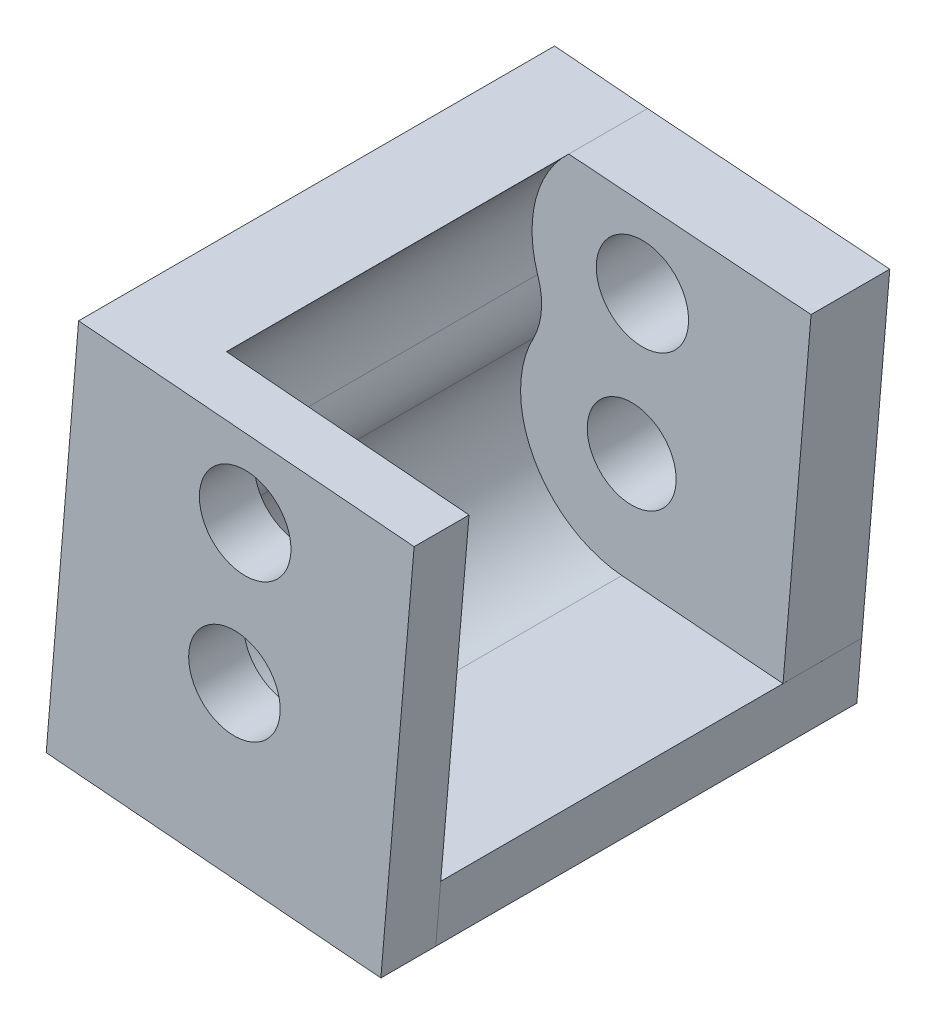
ISO-10303-21;
HEADER;
FILE_DESCRIPTION(('STEP AP214'),'2;1');
FILE_NAME('part.step','',(''),(''),'','','');
FILE_SCHEMA(('AUTOMOTIVE_DESIGN { 1 0 10303 214 1 1 1 1 }'));
ENDSEC;
DATA;
#1=APPLICATION_CONTEXT('core data for automotive mechanical design processes');
#2=APPLICATION_PROTOCOL_DEFINITION('international standard','automotive_design',2000,#1);
#3=PRODUCT_CONTEXT('',#1,'mechanical');
#4=PRODUCT('Part','Part','',(#3));
#5=PRODUCT_RELATED_PRODUCT_CATEGORY('part','',(#4));
#6=PRODUCT_DEFINITION_FORMATION('','',#4);
#7=PRODUCT_DEFINITION_CONTEXT('part definition',#1,'design');
#8=PRODUCT_DEFINITION('design','',#6,#7);
#9=PRODUCT_DEFINITION_SHAPE('','',#8);
#10=(LENGTH_UNIT() NAMED_UNIT(*) SI_UNIT(.MILLI.,.METRE.));
#11=(NAMED_UNIT(*) PLANE_ANGLE_UNIT() SI_UNIT($,.RADIAN.));
#12=(NAMED_UNIT(*) SI_UNIT($,.STERADIAN.) SOLID_ANGLE_UNIT());
#13=UNCERTAINTY_MEASURE_WITH_UNIT(LENGTH_MEASURE(1.E-05),#10,'distance_accuracy_value','');
#14=(GEOMETRIC_REPRESENTATION_CONTEXT(3) GLOBAL_UNCERTAINTY_ASSIGNED_CONTEXT((#13)) GLOBAL_UNIT_ASSIGNED_CONTEXT((#10,
#11,#12)) REPRESENTATION_CONTEXT('',''));
#15=CARTESIAN_POINT('',(0.,0.,0.));
#16=DIRECTION('',(0.,0.,1.));
#17=DIRECTION('',(1.,0.,0.));
#18=AXIS2_PLACEMENT_3D('',#15,#16,#17);
#19=CARTESIAN_POINT('',(198.071940962853,238.265884469313,7.88613249276727));
#20=DIRECTION('',(0.0737247494164092,0.997278627728223,0.));
#21=DIRECTION('',(-0.997278627728223,0.0737247494164092,0.));
#22=AXIS2_PLACEMENT_3D('',#19,#20,#21);
#23=PLANE('',#22);
#24=DIRECTION('',(0.,0.,-1.));
#25=VECTOR('',#24,1.);
#26=CARTESIAN_POINT('',(181.265892710512,239.508287205754,7.88613249276727));
#27=LINE('',#26,#25);
#28=CARTESIAN_POINT('',(181.265892710512,239.508287205754,-23.749));
#29=VERTEX_POINT('',#28);
#30=CARTESIAN_POINT('',(181.265892710512,239.508287205754,-29.21));
#31=VERTEX_POINT('',#30);
#32=EDGE_CURVE('E120',#29,#31,#27,.T.);
#33=ORIENTED_EDGE('',*,*,#32,.F.);
#34=DIRECTION('',(0.997278627728223,-0.0737247494164092,0.));
#35=VECTOR('',#34,1.);
#36=CARTESIAN_POINT('',(198.071940962853,238.265884469313,-23.7490000000001));
#37=LINE('',#36,#35);
#38=CARTESIAN_POINT('',(198.071940962853,238.265884469313,-23.7490000000001));
#39=VERTEX_POINT('',#38);
#40=EDGE_CURVE('E151',#29,#39,#37,.T.);
#41=ORIENTED_EDGE('',*,*,#40,.T.);
#42=DIRECTION('',(0.,0.,-1.));
#43=VECTOR('',#42,1.);
#44=CARTESIAN_POINT('',(198.071940962853,238.265884469313,7.88613249276727));
#45=LINE('',#44,#43);
#46=CARTESIAN_POINT('',(198.071940962853,238.265884469313,-29.21));
#47=VERTEX_POINT('',#46);
#48=EDGE_CURVE('E61',#39,#47,#45,.T.);
#49=ORIENTED_EDGE('',*,*,#48,.T.);
#50=DIRECTION('',(0.997278627728223,-0.0737247494164092,0.));
#51=VECTOR('',#50,1.);
#52=CARTESIAN_POINT('',(198.071940962853,238.265884469313,-29.21));
#53=LINE('',#52,#51);
#54=EDGE_CURVE('E157',#31,#47,#53,.T.);
#55=ORIENTED_EDGE('',*,*,#54,.F.);
#56=EDGE_LOOP('',(#33,#41,#49,#55));
#57=FACE_BOUND('',#56,.T.);
#58=ADVANCED_FACE('F57',(#57),#23,.T.);
#59=CARTESIAN_POINT('',(186.757702214188,233.63416415305,7.88613249276727));
#60=DIRECTION('',(0.,0.,-1.));
#61=DIRECTION('',(-1.,0.,0.));
#62=AXIS2_PLACEMENT_3D('',#59,#60,#61);
#63=CYLINDRICAL_SURFACE('',#62,8.04147332663469);
#64=DIRECTION('',(0.,0.,-1.));
#65=VECTOR('',#64,1.);
#66=CARTESIAN_POINT('',(179.097761141606,231.186594740846,7.88613249276727));
#67=LINE('',#66,#65);
#68=CARTESIAN_POINT('',(179.097761141606,231.186594740846,-23.749));
#69=VERTEX_POINT('',#68);
#70=CARTESIAN_POINT('',(179.097761141606,231.186594740846,-29.21));
#71=VERTEX_POINT('',#70);
#72=EDGE_CURVE('E119',#69,#71,#67,.T.);
#73=ORIENTED_EDGE('',*,*,#72,.F.);
#74=CARTESIAN_POINT('',(186.757702214188,233.63416415305,-23.749));
#75=DIRECTION('',(0.,0.,1.));
#76=DIRECTION('',(0.,-1.,0.));
#77=AXIS2_PLACEMENT_3D('',#74,#75,#76);
#78=CIRCLE('',#77,8.04147332663469);
#79=EDGE_CURVE('E116',#69,#29,#78,.F.);
#80=ORIENTED_EDGE('',*,*,#79,.T.);
#81=ORIENTED_EDGE('',*,*,#32,.T.);
#82=CARTESIAN_POINT('',(186.757702214188,233.63416415305,-29.21));
#83=DIRECTION('',(0.,0.,-1.));
#84=DIRECTION('',(1.,0.,0.));
#85=AXIS2_PLACEMENT_3D('',#82,#83,#84);
#86=CIRCLE('',#85,8.04147332663469);
#87=EDGE_CURVE('E168',#71,#31,#86,.T.);
#88=ORIENTED_EDGE('',*,*,#87,.F.);
#89=EDGE_LOOP('',(#73,#80,#81,#88));
#90=FACE_BOUND('',#89,.T.);
#91=ADVANCED_FACE('F194',(#90),#63,.T.);
#92=CARTESIAN_POINT('',(174.395135054198,229.533490575931,7.88613249276727));
#93=DIRECTION('',(0.,0.,-1.));
#94=DIRECTION('',(-1.,0.,0.));
#95=AXIS2_PLACEMENT_3D('',#92,#93,#94);
#96=CYLINDRICAL_SURFACE('',#95,4.98472120564796);
#97=DIRECTION('',(0.,0.,-1.));
#98=VECTOR('',#97,1.);
#99=CARTESIAN_POINT('',(178.8037688076,227.207250277425,7.88613249276727));
#100=LINE('',#99,#98);
#101=CARTESIAN_POINT('',(178.8037688076,227.207250277425,-23.749));
#102=VERTEX_POINT('',#101);
#103=CARTESIAN_POINT('',(178.8037688076,227.207250277425,-29.21));
#104=VERTEX_POINT('',#103);
#105=EDGE_CURVE('E123',#102,#104,#100,.T.);
#106=ORIENTED_EDGE('',*,*,#105,.F.);
#107=CARTESIAN_POINT('',(174.395135054198,229.533490575931,-23.749));
#108=DIRECTION('',(0.,0.,1.));
#109=DIRECTION('',(0.,-1.,0.));
#110=AXIS2_PLACEMENT_3D('',#107,#108,#109);
#111=CIRCLE('',#110,4.98472120564796);
#112=EDGE_CURVE('E109',#102,#69,#111,.T.);
#113=ORIENTED_EDGE('',*,*,#112,.T.);
#114=ORIENTED_EDGE('',*,*,#72,.T.);
#115=CARTESIAN_POINT('',(174.395135054198,229.533490575931,-29.21));
#116=DIRECTION('',(0.,0.,1.));
#117=DIRECTION('',(-1.,0.,0.));
#118=AXIS2_PLACEMENT_3D('',#115,#116,#117);
#119=CIRCLE('',#118,4.98472120564796);
#120=EDGE_CURVE('E126',#104,#71,#119,.T.);
#121=ORIENTED_EDGE('',*,*,#120,.F.);
#122=EDGE_LOOP('',(#106,#113,#114,#121));
#123=FACE_BOUND('',#122,.T.);
#124=ADVANCED_FACE('F124',(#123),#96,.F.);
#125=CARTESIAN_POINT('',(185.562503172917,223.640966225054,7.88613249276727));
#126=DIRECTION('',(0.,0.,-1.));
#127=DIRECTION('',(-1.,0.,0.));
#128=AXIS2_PLACEMENT_3D('',#125,#126,#127);
#129=CYLINDRICAL_SURFACE('',#128,7.64191547735977);
#130=DIRECTION('',(0.,0.,-1.));
#131=VECTOR('',#130,1.);
#132=CARTESIAN_POINT('',(184.947787901644,216.023814703759,7.88613249276727));
#133=LINE('',#132,#131);
#134=CARTESIAN_POINT('',(184.947787901644,216.023814703759,-23.749));
#135=VERTEX_POINT('',#134);
#136=CARTESIAN_POINT('',(184.947787901644,216.023814703759,-29.21));
#137=VERTEX_POINT('',#136);
#138=EDGE_CURVE('E132',#135,#137,#133,.T.);
#139=ORIENTED_EDGE('',*,*,#138,.F.);
#140=CARTESIAN_POINT('',(185.562503172917,223.640966225054,-23.749));
#141=DIRECTION('',(0.,0.,1.));
#142=DIRECTION('',(0.,-1.,0.));
#143=AXIS2_PLACEMENT_3D('',#140,#141,#142);
#144=CIRCLE('',#143,7.64191547735977);
#145=EDGE_CURVE('E113',#135,#102,#144,.F.);
#146=ORIENTED_EDGE('',*,*,#145,.T.);
#147=ORIENTED_EDGE('',*,*,#105,.T.);
#148=CARTESIAN_POINT('',(185.562503172917,223.640966225054,-29.21));
#149=DIRECTION('',(0.,0.,-1.));
#150=DIRECTION('',(1.,0.,0.));
#151=AXIS2_PLACEMENT_3D('',#148,#149,#150);
#152=CIRCLE('',#151,7.64191547735977);
#153=EDGE_CURVE('E174',#137,#104,#152,.T.);
#154=ORIENTED_EDGE('',*,*,#153,.F.);
#155=EDGE_LOOP('',(#139,#146,#147,#154));
#156=FACE_BOUND('',#155,.T.);
#157=ADVANCED_FACE('F131',(#156),#129,.T.);
#158=CARTESIAN_POINT('',(184.947787901644,216.023814703759,7.88613249276727));
#159=DIRECTION('',(-0.0804399463844235,-0.996759456953217,0.));
#160=DIRECTION('',(0.996759456953217,-0.0804399463844235,0.));
#161=AXIS2_PLACEMENT_3D('',#158,#159,#160);
#162=PLANE('',#161);
#163=DIRECTION('',(0.,0.,-1.));
#164=VECTOR('',#163,1.);
#165=CARTESIAN_POINT('',(196.125935238211,215.121721860638,7.88613249276727));
#166=LINE('',#165,#164);
#167=CARTESIAN_POINT('',(196.125935238211,215.121721860638,-23.749));
#168=VERTEX_POINT('',#167);
#169=CARTESIAN_POINT('',(196.125935238211,215.121721860638,-29.21));
#170=VERTEX_POINT('',#169);
#171=EDGE_CURVE('E139',#168,#170,#166,.T.);
#172=ORIENTED_EDGE('',*,*,#171,.F.);
#173=DIRECTION('',(-0.996759456953217,0.0804399463844235,0.));
#174=VECTOR('',#173,1.);
#175=CARTESIAN_POINT('',(184.947787901644,216.023814703759,-23.749));
#176=LINE('',#175,#174);
#177=EDGE_CURVE('E80',#168,#135,#176,.T.);
#178=ORIENTED_EDGE('',*,*,#177,.T.);
#179=ORIENTED_EDGE('',*,*,#138,.T.);
#180=DIRECTION('',(-0.996759456953216,0.0804399463844235,0.));
#181=VECTOR('',#180,1.);
#182=CARTESIAN_POINT('',(184.947787901644,216.023814703759,-29.21));
#183=LINE('',#182,#181);
#184=EDGE_CURVE('E164',#170,#137,#183,.T.);
#185=ORIENTED_EDGE('',*,*,#184,.F.);
#186=EDGE_LOOP('',(#172,#178,#179,#185));
#187=FACE_BOUND('',#186,.T.);
#188=ADVANCED_FACE('F205',(#187),#162,.T.);
#189=CARTESIAN_POINT('',(198.071940962853,238.265884469313,7.88613249276727));
#190=DIRECTION('',(0.996483748388769,-0.083786270934253,0.));
#191=DIRECTION('',(0.083786270934253,0.996483748388769,0.));
#192=AXIS2_PLACEMENT_3D('',#189,#190,#191);
#193=PLANE('',#192);
#194=ORIENTED_EDGE('',*,*,#48,.F.);
#195=DIRECTION('',(-0.083786270934253,-0.996483748388769,0.));
#196=VECTOR('',#195,1.);
#197=CARTESIAN_POINT('',(198.071940962853,238.265884469313,-23.7490000000001));
#198=LINE('',#197,#196);
#199=EDGE_CURVE('E74',#39,#168,#198,.T.);
#200=ORIENTED_EDGE('',*,*,#199,.T.);
#201=ORIENTED_EDGE('',*,*,#171,.T.);
#202=DIRECTION('',(-0.083786270934253,-0.996483748388769,0.));
#203=VECTOR('',#202,1.);
#204=CARTESIAN_POINT('',(198.071940962853,238.265884469313,-29.21));
#205=LINE('',#204,#203);
#206=EDGE_CURVE('E160',#47,#170,#205,.T.);
#207=ORIENTED_EDGE('',*,*,#206,.F.);
#208=EDGE_LOOP('',(#194,#200,#201,#207));
#209=FACE_BOUND('',#208,.T.);
#210=ADVANCED_FACE('F161',(#209),#193,.T.);
#211=CARTESIAN_POINT('',(185.628460018152,223.677201969771,7.88613249276727));
#212=DIRECTION('',(0.,0.,-1.));
#213=DIRECTION('',(-1.,0.,0.));
#214=AXIS2_PLACEMENT_3D('',#211,#212,#213);
#215=CYLINDRICAL_SURFACE('',#214,3.08373767277871);
#216=CARTESIAN_POINT('',(185.628460018152,223.677201969771,-29.21));
#217=DIRECTION('',(0.,0.,-1.));
#218=DIRECTION('',(-1.,0.,0.));
#219=AXIS2_PLACEMENT_3D('',#216,#217,#218);
#220=CIRCLE('',#219,3.08373767277871);
#221=CARTESIAN_POINT('',(182.544722345374,223.677201969771,-29.21));
#222=VERTEX_POINT('',#221);
#223=EDGE_CURVE('E140',#222,#222,#220,.T.);
#224=ORIENTED_EDGE('',*,*,#223,.T.);
#225=EDGE_LOOP('',(#224));
#226=FACE_BOUND('',#225,.T.);
#227=CARTESIAN_POINT('',(185.628460018152,223.677201969771,-23.749));
#228=DIRECTION('',(0.,0.,1.));
#229=DIRECTION('',(0.,-1.,0.));
#230=AXIS2_PLACEMENT_3D('',#227,#228,#229);
#231=CIRCLE('',#230,3.08373767277871);
#232=CARTESIAN_POINT('',(185.628460018152,220.593464296993,-23.749));
#233=VERTEX_POINT('',#232);
#234=EDGE_CURVE('E12',#233,#233,#231,.F.);
#235=ORIENTED_EDGE('',*,*,#234,.F.);
#236=EDGE_LOOP('',(#235));
#237=FACE_BOUND('',#236,.T.);
#238=ADVANCED_FACE('F183',(#226,#237),#215,.F.);
#239=CARTESIAN_POINT('',(186.372442080018,233.677201969771,7.88613249276727));
#240=DIRECTION('',(0.,0.,-1.));
#241=DIRECTION('',(-1.,0.,0.));
#242=AXIS2_PLACEMENT_3D('',#239,#240,#241);
#243=CYLINDRICAL_SURFACE('',#242,3.20135287037094);
#244=CARTESIAN_POINT('',(186.372442080018,233.677201969771,-29.21));
#245=DIRECTION('',(0.,0.,-1.));
#246=DIRECTION('',(-1.,0.,0.));
#247=AXIS2_PLACEMENT_3D('',#244,#245,#246);
#248=CIRCLE('',#247,3.20135287037094);
#249=CARTESIAN_POINT('',(183.171089209647,233.677201969771,-29.21));
#250=VERTEX_POINT('',#249);
#251=EDGE_CURVE('E145',#250,#250,#248,.T.);
#252=ORIENTED_EDGE('',*,*,#251,.T.);
#253=EDGE_LOOP('',(#252));
#254=FACE_BOUND('',#253,.T.);
#255=CARTESIAN_POINT('',(186.372442080018,233.677201969771,-23.749));
#256=DIRECTION('',(0.,0.,1.));
#257=DIRECTION('',(0.,-1.,0.));
#258=AXIS2_PLACEMENT_3D('',#255,#256,#257);
#259=CIRCLE('',#258,3.20135287037094);
#260=CARTESIAN_POINT('',(186.372442080018,230.4758490994,-23.749));
#261=VERTEX_POINT('',#260);
#262=EDGE_CURVE('E66',#261,#261,#259,.F.);
#263=ORIENTED_EDGE('',*,*,#262,.F.);
#264=EDGE_LOOP('',(#263));
#265=FACE_BOUND('',#264,.T.);
#266=ADVANCED_FACE('F181',(#254,#265),#243,.F.);
#267=CARTESIAN_POINT('',(186.757702214188,233.63416415305,-29.21));
#268=DIRECTION('',(0.,0.,1.));
#269=DIRECTION('',(1.,0.,0.));
#270=AXIS2_PLACEMENT_3D('',#267,#268,#269);
#271=PLANE('',#270);
#272=ORIENTED_EDGE('',*,*,#251,.F.);
#273=EDGE_LOOP('',(#272));
#274=FACE_BOUND('',#273,.T.);
#275=ORIENTED_EDGE('',*,*,#223,.F.);
#276=EDGE_LOOP('',(#275));
#277=FACE_BOUND('',#276,.T.);
#278=ORIENTED_EDGE('',*,*,#54,.T.);
#279=ORIENTED_EDGE('',*,*,#206,.T.);
#280=ORIENTED_EDGE('',*,*,#184,.T.);
#281=ORIENTED_EDGE('',*,*,#153,.T.);
#282=ORIENTED_EDGE('',*,*,#120,.T.);
#283=ORIENTED_EDGE('',*,*,#87,.T.);
#284=EDGE_LOOP('',(#278,#279,#280,#281,#282,#283));
#285=FACE_BOUND('',#284,.T.);
#286=ADVANCED_FACE('F166',(#274,#277,#285),#271,.F.);
#287=CARTESIAN_POINT('',(216.877505131564,216.581396830599,-23.749));
#288=DIRECTION('',(0.,0.,1.));
#289=DIRECTION('',(0.999875524233858,-0.0157777069965269,0.));
#290=AXIS2_PLACEMENT_3D('',#287,#288,#289);
#291=PLANE('',#290);
#292=ORIENTED_EDGE('',*,*,#40,.F.);
#293=ORIENTED_EDGE('',*,*,#79,.F.);
#294=ORIENTED_EDGE('',*,*,#112,.F.);
#295=ORIENTED_EDGE('',*,*,#145,.F.);
#296=ORIENTED_EDGE('',*,*,#177,.F.);
#297=ORIENTED_EDGE('',*,*,#199,.F.);
#298=EDGE_LOOP('',(#292,#293,#294,#295,#296,#297));
#299=FACE_BOUND('',#298,.T.);
#300=ORIENTED_EDGE('',*,*,#262,.T.);
#301=EDGE_LOOP('',(#300));
#302=FACE_BOUND('',#301,.T.);
#303=ORIENTED_EDGE('',*,*,#234,.T.);
#304=EDGE_LOOP('',(#303));
#305=FACE_BOUND('',#304,.T.);
#306=ADVANCED_FACE('F59',(#299,#302,#305),#291,.T.);
#307=CLOSED_SHELL('',(#58,#91,#124,#157,#188,#210,#238,#266,#286,#306));
#308=MANIFOLD_SOLID_BREP('B2',#307);
#309=CARTESIAN_POINT('',(174.395135054198,229.533490575931,-29.21));
#310=DIRECTION('',(0.,0.,1.));
#311=DIRECTION('',(1.,0.,0.));
#312=AXIS2_PLACEMENT_3D('',#309,#310,#311);
#313=CYLINDRICAL_SURFACE('',#312,4.98472120564809);
#314=CARTESIAN_POINT('',(174.395135054198,229.533490575931,0.));
#315=DIRECTION('',(0.,0.,1.));
#316=DIRECTION('',(1.,0.,0.));
#317=AXIS2_PLACEMENT_3D('',#314,#315,#316);
#318=CIRCLE('',#317,4.98472120564809);
#319=CARTESIAN_POINT('',(179.097761141606,231.186594740846,0.));
#320=VERTEX_POINT('',#319);
#321=CARTESIAN_POINT('',(178.8037688076,227.207250277425,0.));
#322=VERTEX_POINT('',#321);
#323=EDGE_CURVE('E371',#320,#322,#318,.F.);
#324=ORIENTED_EDGE('',*,*,#323,.T.);
#325=DIRECTION('',(0.,0.,1.));
#326=VECTOR('',#325,1.);
#327=CARTESIAN_POINT('',(178.8037688076,227.207250277425,-29.21));
#328=LINE('',#327,#326);
#329=CARTESIAN_POINT('',(178.8037688076,227.207250277425,-29.21));
#330=VERTEX_POINT('',#329);
#331=EDGE_CURVE('E55',#330,#322,#328,.T.);
#332=ORIENTED_EDGE('',*,*,#331,.F.);
#333=CARTESIAN_POINT('',(174.395135054198,229.533490575931,-29.21));
#334=DIRECTION('',(0.,0.,1.));
#335=DIRECTION('',(1.,0.,0.));
#336=AXIS2_PLACEMENT_3D('',#333,#334,#335);
#337=CIRCLE('',#336,4.98472120564809);
#338=CARTESIAN_POINT('',(179.097761141606,231.186594740846,-29.21));
#339=VERTEX_POINT('',#338);
#340=EDGE_CURVE('E294',#339,#330,#337,.F.);
#341=ORIENTED_EDGE('',*,*,#340,.F.);
#342=DIRECTION('',(0.,0.,1.));
#343=VECTOR('',#342,1.);
#344=CARTESIAN_POINT('',(179.097761141606,231.186594740846,-29.21));
#345=LINE('',#344,#343);
#346=EDGE_CURVE('E327',#339,#320,#345,.T.);
#347=ORIENTED_EDGE('',*,*,#346,.T.);
#348=EDGE_LOOP('',(#324,#332,#341,#347));
#349=FACE_BOUND('',#348,.T.);
#350=ADVANCED_FACE('F275',(#349),#313,.T.);
#351=CARTESIAN_POINT('',(185.562503172917,223.640966225054,-29.21));
#352=DIRECTION('',(0.,0.,1.));
#353=DIRECTION('',(1.,0.,0.));
#354=AXIS2_PLACEMENT_3D('',#351,#352,#353);
#355=CYLINDRICAL_SURFACE('',#354,7.64191547735976);
#356=CARTESIAN_POINT('',(185.562503172917,223.640966225054,0.));
#357=DIRECTION('',(0.,0.,1.));
#358=DIRECTION('',(1.,0.,0.));
#359=AXIS2_PLACEMENT_3D('',#356,#357,#358);
#360=CIRCLE('',#359,7.64191547735976);
#361=CARTESIAN_POINT('',(184.947787901644,216.023814703759,0.));
#362=VERTEX_POINT('',#361);
#363=EDGE_CURVE('E381',#362,#322,#360,.F.);
#364=ORIENTED_EDGE('',*,*,#363,.F.);
#365=DIRECTION('',(0.,0.,1.));
#366=VECTOR('',#365,1.);
#367=CARTESIAN_POINT('',(184.947787901644,216.023814703759,-29.21));
#368=LINE('',#367,#366);
#369=CARTESIAN_POINT('',(184.947787901644,216.023814703759,-29.21));
#370=VERTEX_POINT('',#369);
#371=EDGE_CURVE('E285',#370,#362,#368,.T.);
#372=ORIENTED_EDGE('',*,*,#371,.F.);
#373=CARTESIAN_POINT('',(185.562503172917,223.640966225054,-29.21));
#374=DIRECTION('',(0.,0.,1.));
#375=DIRECTION('',(1.,0.,0.));
#376=AXIS2_PLACEMENT_3D('',#373,#374,#375);
#377=CIRCLE('',#376,7.64191547735976);
#378=EDGE_CURVE('E348',#370,#330,#377,.F.);
#379=ORIENTED_EDGE('',*,*,#378,.T.);
#380=ORIENTED_EDGE('',*,*,#331,.T.);
#381=EDGE_LOOP('',(#364,#372,#379,#380));
#382=FACE_BOUND('',#381,.T.);
#383=ADVANCED_FACE('F437',(#382),#355,.F.);
#384=CARTESIAN_POINT('',(18.5173537146709,229.454994221892,-29.21));
#385=DIRECTION('',(-0.0804399463844184,-0.996759456953217,0.));
#386=DIRECTION('',(0.996759456953217,-0.0804399463844184,0.));
#387=AXIS2_PLACEMENT_3D('',#384,#385,#386);
#388=PLANE('',#387);
#389=DIRECTION('',(0.996759456953217,-0.0804399463844184,0.));
#390=VECTOR('',#389,1.);
#391=CARTESIAN_POINT('',(18.5173537146709,229.454994221892,0.));
#392=LINE('',#391,#390);
#393=CARTESIAN_POINT('',(196.130274040535,215.12136194235,0.));
#394=VERTEX_POINT('',#393);
#395=EDGE_CURVE('E316',#362,#394,#392,.T.);
#396=ORIENTED_EDGE('',*,*,#395,.T.);
#397=DIRECTION('',(0.,0.,1.));
#398=VECTOR('',#397,1.);
#399=CARTESIAN_POINT('',(196.125935238211,215.121721860638,-29.21));
#400=LINE('',#399,#398);
#401=CARTESIAN_POINT('',(196.125935238211,215.121721860638,-29.21));
#402=VERTEX_POINT('',#401);
#403=EDGE_CURVE('E351',#402,#394,#400,.T.);
#404=ORIENTED_EDGE('',*,*,#403,.F.);
#405=DIRECTION('',(0.996759456953217,-0.0804399463844184,0.));
#406=VECTOR('',#405,1.);
#407=CARTESIAN_POINT('',(18.5173537146709,229.454994221892,-29.21));
#408=LINE('',#407,#406);
#409=EDGE_CURVE('E342',#370,#402,#408,.T.);
#410=ORIENTED_EDGE('',*,*,#409,.F.);
#411=ORIENTED_EDGE('',*,*,#371,.T.);
#412=EDGE_LOOP('',(#396,#404,#410,#411));
#413=FACE_BOUND('',#412,.T.);
#414=ADVANCED_FACE('F352',(#413),#388,.F.);
#415=CARTESIAN_POINT('',(177.034833765712,-14.7057689392394,-29.21));
#416=DIRECTION('',(-0.996567681493963,0.0827819799337262,0.));
#417=DIRECTION('',(-0.0827819799337262,-0.996567681493963,0.));
#418=AXIS2_PLACEMENT_3D('',#415,#416,#417);
#419=PLANE('',#418);
#420=CARTESIAN_POINT('',(196.125935238211,215.121721860638,0.));
#421=DIRECTION('',(-0.0827819799337307,-0.996567681493962,0.));
#422=VECTOR('',#421,1.);
#423=LINE('',#420,#422);
#424=CARTESIAN_POINT('',(195.787327751741,211.045408658197,0.));
#425=VERTEX_POINT('',#424);
#426=EDGE_CURVE('E380',#394,#425,#423,.T.);
#427=ORIENTED_EDGE('',*,*,#426,.T.);
#428=DIRECTION('',(0.,0.,1.));
#429=VECTOR('',#428,1.);
#430=CARTESIAN_POINT('',(195.787327751741,211.045408658197,-29.21));
#431=LINE('',#430,#429);
#432=CARTESIAN_POINT('',(195.787327751741,211.045408658197,-29.21));
#433=VERTEX_POINT('',#432);
#434=EDGE_CURVE('E356',#433,#425,#431,.T.);
#435=ORIENTED_EDGE('',*,*,#434,.F.);
#436=DIRECTION('',(-0.0827819799337262,-0.996567681493963,0.));
#437=VECTOR('',#436,1.);
#438=CARTESIAN_POINT('',(177.034833765712,-14.7057689392394,-29.21));
#439=LINE('',#438,#437);
#440=EDGE_CURVE('E345',#402,#433,#439,.T.);
#441=ORIENTED_EDGE('',*,*,#440,.F.);
#442=ORIENTED_EDGE('',*,*,#403,.T.);
#443=EDGE_LOOP('',(#427,#435,#441,#442));
#444=FACE_BOUND('',#443,.T.);
#445=ADVANCED_FACE('F358',(#444),#419,.F.);
#446=CARTESIAN_POINT('',(18.7524939860288,225.751177597436,-29.21));
#447=DIRECTION('',(0.082781979933727,0.996567681493962,0.));
#448=DIRECTION('',(-0.996567681493963,0.082781979933727,0.));
#449=AXIS2_PLACEMENT_3D('',#446,#447,#448);
#450=PLANE('',#449);
#451=ORIENTED_EDGE('',*,*,#434,.T.);
#452=DIRECTION('',(0.,0.,-1.));
#453=VECTOR('',#452,1.);
#454=CARTESIAN_POINT('',(195.787327751741,211.045408658197,3.81000000000004));
#455=LINE('',#454,#453);
#456=CARTESIAN_POINT('',(195.787327751741,211.045408658197,3.81000000000004));
#457=VERTEX_POINT('',#456);
#458=EDGE_CURVE('E376',#457,#425,#455,.T.);
#459=ORIENTED_EDGE('',*,*,#458,.F.);
#460=DIRECTION('',(0.996567681493963,-0.0827819799337271,0.));
#461=VECTOR('',#460,1.);
#462=CARTESIAN_POINT('',(195.787327751741,211.045408658197,3.81000000000004));
#463=LINE('',#462,#461);
#464=CARTESIAN_POINT('',(172.571039375647,212.973918235794,3.81000000000004));
#465=VERTEX_POINT('',#464);
#466=EDGE_CURVE('E467',#465,#457,#463,.T.);
#467=ORIENTED_EDGE('',*,*,#466,.F.);
#468=DIRECTION('',(0.,0.,1.));
#469=VECTOR('',#468,1.);
#470=CARTESIAN_POINT('',(172.571039375647,212.973918235794,-29.21));
#471=LINE('',#470,#469);
#472=CARTESIAN_POINT('',(172.571039375647,212.973918235794,-29.21));
#473=VERTEX_POINT('',#472);
#474=EDGE_CURVE('E387',#473,#465,#471,.T.);
#475=ORIENTED_EDGE('',*,*,#474,.F.);
#476=DIRECTION('',(-0.996567681493963,0.082781979933727,0.));
#477=VECTOR('',#476,1.);
#478=CARTESIAN_POINT('',(18.7524939860288,225.751177597436,-29.21));
#479=LINE('',#478,#477);
#480=EDGE_CURVE('E362',#433,#473,#479,.T.);
#481=ORIENTED_EDGE('',*,*,#480,.F.);
#482=EDGE_LOOP('',(#451,#459,#467,#475,#481));
#483=FACE_BOUND('',#482,.T.);
#484=ADVANCED_FACE('F416',(#483),#450,.F.);
#485=CARTESIAN_POINT('',(153.818545389618,-12.7772593616419,-29.21));
#486=DIRECTION('',(0.996567681493962,-0.0827819799337273,0.));
#487=DIRECTION('',(0.0827819799337273,0.996567681493963,0.));
#488=AXIS2_PLACEMENT_3D('',#485,#486,#487);
#489=PLANE('',#488);
#490=ORIENTED_EDGE('',*,*,#474,.T.);
#491=DIRECTION('',(-0.0827819799337262,-0.996567681493963,0.));
#492=VECTOR('',#491,1.);
#493=CARTESIAN_POINT('',(172.571039375647,212.973918235794,3.81000000000004));
#494=LINE('',#493,#492);
#495=CARTESIAN_POINT('',(174.819652235249,240.043757660577,3.81000000000004));
#496=VERTEX_POINT('',#495);
#497=EDGE_CURVE('E471',#496,#465,#494,.T.);
#498=ORIENTED_EDGE('',*,*,#497,.F.);
#499=DIRECTION('',(0.,0.,1.));
#500=VECTOR('',#499,1.);
#501=CARTESIAN_POINT('',(174.819652235249,240.043757660577,-29.21));
#502=LINE('',#501,#500);
#503=CARTESIAN_POINT('',(174.819652235249,240.043757660577,-29.21));
#504=VERTEX_POINT('',#503);
#505=EDGE_CURVE('E391',#504,#496,#502,.T.);
#506=ORIENTED_EDGE('',*,*,#505,.F.);
#507=DIRECTION('',(0.0827819799337273,0.996567681493963,0.));
#508=VECTOR('',#507,1.);
#509=CARTESIAN_POINT('',(153.818545389618,-12.7772593616419,-29.21));
#510=LINE('',#509,#508);
#511=EDGE_CURVE('E365',#473,#504,#510,.T.);
#512=ORIENTED_EDGE('',*,*,#511,.F.);
#513=EDGE_LOOP('',(#490,#498,#506,#512));
#514=FACE_BOUND('',#513,.T.);
#515=ADVANCED_FACE('F420',(#514),#489,.F.);
#516=CARTESIAN_POINT('',(21.001106845631,252.821017022218,-29.21));
#517=DIRECTION('',(-0.0827819799337259,-0.996567681493963,0.));
#518=DIRECTION('',(0.996567681493963,-0.0827819799337259,0.));
#519=AXIS2_PLACEMENT_3D('',#516,#517,#518);
#520=PLANE('',#519);
#521=ORIENTED_EDGE('',*,*,#505,.T.);
#522=DIRECTION('',(-0.996567681493963,0.0827819799337275,0.));
#523=VECTOR('',#522,1.);
#524=CARTESIAN_POINT('',(174.819652235249,240.043757660577,3.81000000000004));
#525=LINE('',#524,#523);
#526=CARTESIAN_POINT('',(198.093437375568,238.110471993938,3.81000000000004));
#527=VERTEX_POINT('',#526);
#528=EDGE_CURVE('E459',#527,#496,#525,.T.);
#529=ORIENTED_EDGE('',*,*,#528,.F.);
#530=DIRECTION('',(0.,0.,-1.));
#531=VECTOR('',#530,1.);
#532=CARTESIAN_POINT('',(198.093437375568,238.110471993938,3.81000000000004));
#533=LINE('',#532,#531);
#534=CARTESIAN_POINT('',(198.093437375568,238.110471993938,0.));
#535=VERTEX_POINT('',#534);
#536=EDGE_CURVE('E455',#527,#535,#533,.T.);
#537=ORIENTED_EDGE('',*,*,#536,.T.);
#538=DIRECTION('',(-0.996567681493963,0.0827819799337275,0.));
#539=VECTOR('',#538,1.);
#540=CARTESIAN_POINT('',(174.819652235249,240.043757660577,0.));
#541=LINE('',#540,#539);
#542=CARTESIAN_POINT('',(181.265892710512,239.508287205754,0.));
#543=VERTEX_POINT('',#542);
#544=EDGE_CURVE('E475',#535,#543,#541,.T.);
#545=ORIENTED_EDGE('',*,*,#544,.T.);
#546=DIRECTION('',(0.,0.,1.));
#547=VECTOR('',#546,1.);
#548=CARTESIAN_POINT('',(181.265892710512,239.508287205754,-29.21));
#549=LINE('',#548,#547);
#550=CARTESIAN_POINT('',(181.265892710512,239.508287205754,-29.21));
#551=VERTEX_POINT('',#550);
#552=EDGE_CURVE('E395',#551,#543,#549,.T.);
#553=ORIENTED_EDGE('',*,*,#552,.F.);
#554=DIRECTION('',(0.996567681493963,-0.0827819799337259,0.));
#555=VECTOR('',#554,1.);
#556=CARTESIAN_POINT('',(21.001106845631,252.821017022218,-29.21));
#557=LINE('',#556,#555);
#558=EDGE_CURVE('E650',#504,#551,#557,.T.);
#559=ORIENTED_EDGE('',*,*,#558,.F.);
#560=EDGE_LOOP('',(#521,#529,#537,#545,#553,#559));
#561=FACE_BOUND('',#560,.T.);
#562=ADVANCED_FACE('F424',(#561),#520,.F.);
#563=CARTESIAN_POINT('',(186.757702214188,233.63416415305,-29.21));
#564=DIRECTION('',(0.,0.,1.));
#565=DIRECTION('',(1.,0.,0.));
#566=AXIS2_PLACEMENT_3D('',#563,#564,#565);
#567=CYLINDRICAL_SURFACE('',#566,8.04147332663468);
#568=CARTESIAN_POINT('',(186.757702214188,233.63416415305,0.));
#569=DIRECTION('',(0.,0.,1.));
#570=DIRECTION('',(1.,0.,0.));
#571=AXIS2_PLACEMENT_3D('',#568,#569,#570);
#572=CIRCLE('',#571,8.04147332663468);
#573=EDGE_CURVE('E375',#320,#543,#572,.F.);
#574=ORIENTED_EDGE('',*,*,#573,.F.);
#575=ORIENTED_EDGE('',*,*,#346,.F.);
#576=CARTESIAN_POINT('',(186.757702214188,233.63416415305,-29.21));
#577=DIRECTION('',(0.,0.,1.));
#578=DIRECTION('',(1.,0.,0.));
#579=AXIS2_PLACEMENT_3D('',#576,#577,#578);
#580=CIRCLE('',#579,8.04147332663468);
#581=EDGE_CURVE('E649',#339,#551,#580,.F.);
#582=ORIENTED_EDGE('',*,*,#581,.T.);
#583=ORIENTED_EDGE('',*,*,#552,.T.);
#584=EDGE_LOOP('',(#574,#575,#582,#583));
#585=FACE_BOUND('',#584,.T.);
#586=ADVANCED_FACE('F427',(#585),#567,.F.);
#587=CARTESIAN_POINT('',(0.,0.,-29.21));
#588=DIRECTION('',(0.,0.,1.));
#589=DIRECTION('',(1.,0.,0.));
#590=AXIS2_PLACEMENT_3D('',#587,#588,#589);
#591=PLANE('',#590);
#592=ORIENTED_EDGE('',*,*,#340,.T.);
#593=ORIENTED_EDGE('',*,*,#378,.F.);
#594=ORIENTED_EDGE('',*,*,#409,.T.);
#595=ORIENTED_EDGE('',*,*,#440,.T.);
#596=ORIENTED_EDGE('',*,*,#480,.T.);
#597=ORIENTED_EDGE('',*,*,#511,.T.);
#598=ORIENTED_EDGE('',*,*,#558,.T.);
#599=ORIENTED_EDGE('',*,*,#581,.F.);
#600=EDGE_LOOP('',(#592,#593,#594,#595,#596,#597,#598,#599));
#601=FACE_BOUND('',#600,.T.);
#602=ADVANCED_FACE('F343',(#601),#591,.F.);
#603=CARTESIAN_POINT('',(0.,0.,0.));
#604=DIRECTION('',(0.,0.,-1.));
#605=DIRECTION('',(-1.,0.,0.));
#606=AXIS2_PLACEMENT_3D('',#603,#604,#605);
#607=PLANE('',#606);
#608=CARTESIAN_POINT('',(186.372442080018,233.677201969771,0.));
#609=DIRECTION('',(0.,0.,1.));
#610=DIRECTION('',(1.,0.,0.));
#611=AXIS2_PLACEMENT_3D('',#608,#609,#610);
#612=CIRCLE('',#611,3.17500000000002);
#613=CARTESIAN_POINT('',(183.197442080018,233.677201969771,0.));
#614=VERTEX_POINT('',#613);
#615=EDGE_CURVE('E484',#614,#614,#612,.T.);
#616=ORIENTED_EDGE('',*,*,#615,.T.);
#617=EDGE_LOOP('',(#616));
#618=FACE_BOUND('',#617,.T.);
#619=CARTESIAN_POINT('',(185.628460018152,223.677201969771,0.));
#620=DIRECTION('',(0.,0.,1.));
#621=DIRECTION('',(1.,0.,0.));
#622=AXIS2_PLACEMENT_3D('',#619,#620,#621);
#623=CIRCLE('',#622,3.17499999999994);
#624=CARTESIAN_POINT('',(182.453460018152,223.677201969771,0.));
#625=VERTEX_POINT('',#624);
#626=EDGE_CURVE('E492',#625,#625,#623,.T.);
#627=ORIENTED_EDGE('',*,*,#626,.T.);
#628=EDGE_LOOP('',(#627));
#629=FACE_BOUND('',#628,.T.);
#630=ORIENTED_EDGE('',*,*,#323,.F.);
#631=ORIENTED_EDGE('',*,*,#573,.T.);
#632=ORIENTED_EDGE('',*,*,#544,.F.);
#633=CARTESIAN_POINT('',(196.1345934748,215.121003630707,0.));
#634=DIRECTION('',(0.0848985138388221,0.996389603693234,0.));
#635=VECTOR('',#634,1.);
#636=LINE('',#633,#635);
#637=EDGE_CURVE('E448',#394,#535,#636,.T.);
#638=ORIENTED_EDGE('',*,*,#637,.F.);
#639=ORIENTED_EDGE('',*,*,#395,.F.);
#640=ORIENTED_EDGE('',*,*,#363,.T.);
#641=EDGE_LOOP('',(#630,#631,#632,#638,#639,#640));
#642=FACE_BOUND('',#641,.T.);
#643=ADVANCED_FACE('F434',(#618,#629,#642),#607,.T.);
#644=CARTESIAN_POINT('',(0.,0.,3.81000000000004));
#645=DIRECTION('',(0.,0.,-1.));
#646=DIRECTION('',(-1.,0.,0.));
#647=AXIS2_PLACEMENT_3D('',#644,#645,#646);
#648=PLANE('',#647);
#649=ORIENTED_EDGE('',*,*,#497,.T.);
#650=ORIENTED_EDGE('',*,*,#466,.T.);
#651=DIRECTION('',(0.0848985138388216,0.996389603693234,0.));
#652=VECTOR('',#651,1.);
#653=CARTESIAN_POINT('',(198.093437375568,238.110471993938,3.81000000000004));
#654=LINE('',#653,#652);
#655=EDGE_CURVE('E463',#457,#527,#654,.T.);
#656=ORIENTED_EDGE('',*,*,#655,.T.);
#657=ORIENTED_EDGE('',*,*,#528,.T.);
#658=EDGE_LOOP('',(#649,#650,#656,#657));
#659=FACE_BOUND('',#658,.T.);
#660=CARTESIAN_POINT('',(186.372442080018,233.677201969771,3.81000000000004));
#661=DIRECTION('',(0.,0.,1.));
#662=DIRECTION('',(1.,0.,0.));
#663=AXIS2_PLACEMENT_3D('',#660,#661,#662);
#664=CIRCLE('',#663,3.17500000000002);
#665=CARTESIAN_POINT('',(183.197442080018,233.677201969771,3.81000000000004));
#666=VERTEX_POINT('',#665);
#667=EDGE_CURVE('E481',#666,#666,#664,.T.);
#668=ORIENTED_EDGE('',*,*,#667,.F.);
#669=EDGE_LOOP('',(#668));
#670=FACE_BOUND('',#669,.T.);
#671=CARTESIAN_POINT('',(185.628460018152,223.677201969771,3.81000000000004));
#672=DIRECTION('',(0.,0.,1.));
#673=DIRECTION('',(1.,0.,0.));
#674=AXIS2_PLACEMENT_3D('',#671,#672,#673);
#675=CIRCLE('',#674,3.17499999999994);
#676=CARTESIAN_POINT('',(182.453460018152,223.677201969771,3.81000000000004));
#677=VERTEX_POINT('',#676);
#678=EDGE_CURVE('E488',#677,#677,#675,.T.);
#679=ORIENTED_EDGE('',*,*,#678,.F.);
#680=EDGE_LOOP('',(#679));
#681=FACE_BOUND('',#680,.T.);
#682=ADVANCED_FACE('F518',(#659,#670,#681),#648,.F.);
#683=CARTESIAN_POINT('',(198.093437375568,238.110471993938,3.81000000000004));
#684=DIRECTION('',(-0.996389603693234,0.0848985138388216,0.));
#685=DIRECTION('',(-0.0848985138388216,-0.996389603693234,0.));
#686=AXIS2_PLACEMENT_3D('',#683,#684,#685);
#687=PLANE('',#686);
#688=ORIENTED_EDGE('',*,*,#426,.F.);
#689=ORIENTED_EDGE('',*,*,#637,.T.);
#690=ORIENTED_EDGE('',*,*,#536,.F.);
#691=ORIENTED_EDGE('',*,*,#655,.F.);
#692=ORIENTED_EDGE('',*,*,#458,.T.);
#693=EDGE_LOOP('',(#688,#689,#690,#691,#692));
#694=FACE_BOUND('',#693,.T.);
#695=ADVANCED_FACE('F509',(#694),#687,.F.);
#696=CARTESIAN_POINT('',(186.372442080018,233.677201969771,3.81000000000004));
#697=DIRECTION('',(0.,0.,-1.));
#698=DIRECTION('',(-1.,0.,0.));
#699=AXIS2_PLACEMENT_3D('',#696,#697,#698);
#700=CYLINDRICAL_SURFACE('',#699,3.17500000000002);
#701=CARTESIAN_POINT('',(183.197442080018,233.677201969771,3.81000000000004));
#702=CARTESIAN_POINT('',(183.197442080018,233.677201969771,3.77031250000004));
#703=CARTESIAN_POINT('',(183.197442080018,233.677201969771,3.73062500000004));
#704=CARTESIAN_POINT('',(183.197442080018,233.677201969771,3.65125000000004));
#705=CARTESIAN_POINT('',(183.197442080018,233.677201969771,3.61156250000004));
#706=CARTESIAN_POINT('',(183.197442080018,233.677201969771,3.53218750000004));
#707=CARTESIAN_POINT('',(183.197442080018,233.677201969771,3.49250000000004));
#708=CARTESIAN_POINT('',(183.197442080018,233.677201969771,3.41312500000004));
#709=CARTESIAN_POINT('',(183.197442080018,233.677201969771,3.37343750000004));
#710=CARTESIAN_POINT('',(183.197442080018,233.677201969771,3.29406250000004));
#711=CARTESIAN_POINT('',(183.197442080018,233.677201969771,3.25437500000004));
#712=CARTESIAN_POINT('',(183.197442080018,233.677201969771,3.17500000000003));
#713=CARTESIAN_POINT('',(183.197442080018,233.677201969771,3.13531250000003));
#714=CARTESIAN_POINT('',(183.197442080018,233.677201969771,3.05593750000003));
#715=CARTESIAN_POINT('',(183.197442080018,233.677201969771,3.01625000000003));
#716=CARTESIAN_POINT('',(183.197442080018,233.677201969771,2.93687500000003));
#717=CARTESIAN_POINT('',(183.197442080018,233.677201969771,2.89718750000003));
#718=CARTESIAN_POINT('',(183.197442080018,233.677201969771,2.81781250000003));
#719=CARTESIAN_POINT('',(183.197442080018,233.677201969771,2.77812500000003));
#720=CARTESIAN_POINT('',(183.197442080018,233.677201969771,2.69875000000003));
#721=CARTESIAN_POINT('',(183.197442080018,233.677201969771,2.65906250000003));
#722=CARTESIAN_POINT('',(183.197442080018,233.677201969771,2.57968750000003));
#723=CARTESIAN_POINT('',(183.197442080018,233.677201969771,2.54000000000003));
#724=CARTESIAN_POINT('',(183.197442080018,233.677201969771,2.46062500000003));
#725=CARTESIAN_POINT('',(183.197442080018,233.677201969771,2.42093750000003));
#726=CARTESIAN_POINT('',(183.197442080018,233.677201969771,2.34156250000003));
#727=CARTESIAN_POINT('',(183.197442080018,233.677201969771,2.30187500000003));
#728=CARTESIAN_POINT('',(183.197442080018,233.677201969771,2.22250000000002));
#729=CARTESIAN_POINT('',(183.197442080018,233.677201969771,2.18281250000002));
#730=CARTESIAN_POINT('',(183.197442080018,233.677201969771,2.10343750000002));
#731=CARTESIAN_POINT('',(183.197442080018,233.677201969771,2.06375000000002));
#732=CARTESIAN_POINT('',(183.197442080018,233.677201969771,1.98437500000002));
#733=CARTESIAN_POINT('',(183.197442080018,233.677201969771,1.94468750000002));
#734=CARTESIAN_POINT('',(183.197442080018,233.677201969771,1.86531250000002));
#735=CARTESIAN_POINT('',(183.197442080018,233.677201969771,1.82562500000002));
#736=CARTESIAN_POINT('',(183.197442080018,233.677201969771,1.74625000000002));
#737=CARTESIAN_POINT('',(183.197442080018,233.677201969771,1.70656250000002));
#738=CARTESIAN_POINT('',(183.197442080018,233.677201969771,1.62718750000002));
#739=CARTESIAN_POINT('',(183.197442080018,233.677201969771,1.58750000000002));
#740=CARTESIAN_POINT('',(183.197442080018,233.677201969771,1.50812500000002));
#741=CARTESIAN_POINT('',(183.197442080018,233.677201969771,1.46843750000002));
#742=CARTESIAN_POINT('',(183.197442080018,233.677201969771,1.38906250000001));
#743=CARTESIAN_POINT('',(183.197442080018,233.677201969771,1.34937500000001));
#744=CARTESIAN_POINT('',(183.197442080018,233.677201969771,1.27000000000001));
#745=CARTESIAN_POINT('',(183.197442080018,233.677201969771,1.23031250000001));
#746=CARTESIAN_POINT('',(183.197442080018,233.677201969771,1.15093750000001));
#747=CARTESIAN_POINT('',(183.197442080018,233.677201969771,1.11125000000001));
#748=CARTESIAN_POINT('',(183.197442080018,233.677201969771,1.03187500000001));
#749=CARTESIAN_POINT('',(183.197442080018,233.677201969771,0.992187500000011));
#750=CARTESIAN_POINT('',(183.197442080018,233.677201969771,0.91281250000001));
#751=CARTESIAN_POINT('',(183.197442080018,233.677201969771,0.873125000000009));
#752=CARTESIAN_POINT('',(183.197442080018,233.677201969771,0.793750000000009));
#753=CARTESIAN_POINT('',(183.197442080018,233.677201969771,0.754062500000008));
#754=CARTESIAN_POINT('',(183.197442080018,233.677201969771,0.674687500000007));
#755=CARTESIAN_POINT('',(183.197442080018,233.677201969771,0.635000000000007));
#756=CARTESIAN_POINT('',(183.197442080018,233.677201969771,0.555625000000006));
#757=CARTESIAN_POINT('',(183.197442080018,233.677201969771,0.515937500000005));
#758=CARTESIAN_POINT('',(183.197442080018,233.677201969771,0.436562500000005));
#759=CARTESIAN_POINT('',(183.197442080018,233.677201969771,0.396875000000004));
#760=CARTESIAN_POINT('',(183.197442080018,233.677201969771,0.317500000000003));
#761=CARTESIAN_POINT('',(183.197442080018,233.677201969771,0.277812500000003));
#762=CARTESIAN_POINT('',(183.197442080018,233.677201969771,0.198437500000002));
#763=CARTESIAN_POINT('',(183.197442080018,233.677201969771,0.158750000000001));
#764=CARTESIAN_POINT('',(183.197442080018,233.677201969771,0.0793750000000006));
#765=CARTESIAN_POINT('',(183.197442080018,233.677201969771,0.0396875000000001));
#766=CARTESIAN_POINT('',(183.197442080018,233.677201969771,0.));
#767=B_SPLINE_CURVE_WITH_KNOTS('',3,(#701,#702,#703,#704,#705,#706,#707,#708,#709,#710,#711,
#712,#713,#714,#715,#716,#717,#718,#719,#720,#721,#722,#723,#724,#725,#726,#727,#728,#729,#730,
#731,#732,#733,#734,#735,#736,#737,#738,#739,#740,#741,#742,#743,#744,#745,#746,#747,#748,#749,
#750,#751,#752,#753,#754,#755,#756,#757,#758,#759,#760,#761,#762,#763,#764,#765,#766),
.UNSPECIFIED.,.F.,.F.,(4,2,2,2,2,2,2,2,2,2,2,2,2,2,2,2,2,2,2,2,2,2,2,2,2,2,2,2,2,2,2,2,4),(0.,
0.119062500000001,0.238125000000003,0.357187500000004,0.476250000000005,0.595312500000006,
0.714375000000008,0.833437500000009,0.95250000000001,1.07156250000001,1.19062500000001,
1.30968750000001,1.42875000000002,1.54781250000002,1.66687500000002,1.78593750000002,
1.90500000000002,2.02406250000002,2.14312500000002,2.26218750000002,2.38125000000003,
2.50031250000003,2.61937500000003,2.73843750000003,2.85750000000003,2.97656250000003,
3.09562500000003,3.21468750000004,3.33375000000004,3.45281250000004,3.57187500000004,
3.69093750000004,3.81000000000004),.UNSPECIFIED.);
#768=EDGE_CURVE('BSEAM517',#666,#614,#767,.T.);
#769=ORIENTED_EDGE('',*,*,#667,.T.);
#770=ORIENTED_EDGE('',*,*,#615,.F.);
#771=ORIENTED_EDGE('',*,*,#768,.T.);
#772=ORIENTED_EDGE('',*,*,#768,.F.);
#773=EDGE_LOOP('',(#769,#771,#770,#772));
#774=FACE_BOUND('',#773,.T.);
#775=ADVANCED_FACE('F517',(#774),#700,.F.);
#776=CARTESIAN_POINT('',(185.628460018152,223.677201969771,3.81000000000004));
#777=DIRECTION('',(0.,0.,-1.));
#778=DIRECTION('',(-1.,0.,0.));
#779=AXIS2_PLACEMENT_3D('',#776,#777,#778);
#780=CYLINDRICAL_SURFACE('',#779,3.17499999999994);
#781=CARTESIAN_POINT('',(182.453460018152,223.677201969771,3.81000000000004));
#782=CARTESIAN_POINT('',(182.453460018152,223.677201969771,3.77031250000004));
#783=CARTESIAN_POINT('',(182.453460018152,223.677201969771,3.73062500000004));
#784=CARTESIAN_POINT('',(182.453460018152,223.677201969771,3.65125000000004));
#785=CARTESIAN_POINT('',(182.453460018152,223.677201969771,3.61156250000004));
#786=CARTESIAN_POINT('',(182.453460018152,223.677201969771,3.53218750000004));
#787=CARTESIAN_POINT('',(182.453460018152,223.677201969771,3.49250000000004));
#788=CARTESIAN_POINT('',(182.453460018152,223.677201969771,3.41312500000004));
#789=CARTESIAN_POINT('',(182.453460018152,223.677201969771,3.37343750000004));
#790=CARTESIAN_POINT('',(182.453460018152,223.677201969771,3.29406250000004));
#791=CARTESIAN_POINT('',(182.453460018152,223.677201969771,3.25437500000004));
#792=CARTESIAN_POINT('',(182.453460018152,223.677201969771,3.17500000000003));
#793=CARTESIAN_POINT('',(182.453460018152,223.677201969771,3.13531250000003));
#794=CARTESIAN_POINT('',(182.453460018152,223.677201969771,3.05593750000003));
#795=CARTESIAN_POINT('',(182.453460018152,223.677201969771,3.01625000000003));
#796=CARTESIAN_POINT('',(182.453460018152,223.677201969771,2.93687500000003));
#797=CARTESIAN_POINT('',(182.453460018152,223.677201969771,2.89718750000003));
#798=CARTESIAN_POINT('',(182.453460018152,223.677201969771,2.81781250000003));
#799=CARTESIAN_POINT('',(182.453460018152,223.677201969771,2.77812500000003));
#800=CARTESIAN_POINT('',(182.453460018152,223.677201969771,2.69875000000003));
#801=CARTESIAN_POINT('',(182.453460018152,223.677201969771,2.65906250000003));
#802=CARTESIAN_POINT('',(182.453460018152,223.677201969771,2.57968750000003));
#803=CARTESIAN_POINT('',(182.453460018152,223.677201969771,2.54000000000003));
#804=CARTESIAN_POINT('',(182.453460018152,223.677201969771,2.46062500000003));
#805=CARTESIAN_POINT('',(182.453460018152,223.677201969771,2.42093750000003));
#806=CARTESIAN_POINT('',(182.453460018152,223.677201969771,2.34156250000003));
#807=CARTESIAN_POINT('',(182.453460018152,223.677201969771,2.30187500000003));
#808=CARTESIAN_POINT('',(182.453460018152,223.677201969771,2.22250000000002));
#809=CARTESIAN_POINT('',(182.453460018152,223.677201969771,2.18281250000002));
#810=CARTESIAN_POINT('',(182.453460018152,223.677201969771,2.10343750000002));
#811=CARTESIAN_POINT('',(182.453460018152,223.677201969771,2.06375000000002));
#812=CARTESIAN_POINT('',(182.453460018152,223.677201969771,1.98437500000002));
#813=CARTESIAN_POINT('',(182.453460018152,223.677201969771,1.94468750000002));
#814=CARTESIAN_POINT('',(182.453460018152,223.677201969771,1.86531250000002));
#815=CARTESIAN_POINT('',(182.453460018152,223.677201969771,1.82562500000002));
#816=CARTESIAN_POINT('',(182.453460018152,223.677201969771,1.74625000000002));
#817=CARTESIAN_POINT('',(182.453460018152,223.677201969771,1.70656250000002));
#818=CARTESIAN_POINT('',(182.453460018152,223.677201969771,1.62718750000002));
#819=CARTESIAN_POINT('',(182.453460018152,223.677201969771,1.58750000000002));
#820=CARTESIAN_POINT('',(182.453460018152,223.677201969771,1.50812500000002));
#821=CARTESIAN_POINT('',(182.453460018152,223.677201969771,1.46843750000002));
#822=CARTESIAN_POINT('',(182.453460018152,223.677201969771,1.38906250000001));
#823=CARTESIAN_POINT('',(182.453460018152,223.677201969771,1.34937500000001));
#824=CARTESIAN_POINT('',(182.453460018152,223.677201969771,1.27000000000001));
#825=CARTESIAN_POINT('',(182.453460018152,223.677201969771,1.23031250000001));
#826=CARTESIAN_POINT('',(182.453460018152,223.677201969771,1.15093750000001));
#827=CARTESIAN_POINT('',(182.453460018152,223.677201969771,1.11125000000001));
#828=CARTESIAN_POINT('',(182.453460018152,223.677201969771,1.03187500000001));
#829=CARTESIAN_POINT('',(182.453460018152,223.677201969771,0.992187500000011));
#830=CARTESIAN_POINT('',(182.453460018152,223.677201969771,0.91281250000001));
#831=CARTESIAN_POINT('',(182.453460018152,223.677201969771,0.873125000000009));
#832=CARTESIAN_POINT('',(182.453460018152,223.677201969771,0.793750000000009));
#833=CARTESIAN_POINT('',(182.453460018152,223.677201969771,0.754062500000008));
#834=CARTESIAN_POINT('',(182.453460018152,223.677201969771,0.674687500000007));
#835=CARTESIAN_POINT('',(182.453460018152,223.677201969771,0.635000000000007));
#836=CARTESIAN_POINT('',(182.453460018152,223.677201969771,0.555625000000006));
#837=CARTESIAN_POINT('',(182.453460018152,223.677201969771,0.515937500000005));
#838=CARTESIAN_POINT('',(182.453460018152,223.677201969771,0.436562500000005));
#839=CARTESIAN_POINT('',(182.453460018152,223.677201969771,0.396875000000004));
#840=CARTESIAN_POINT('',(182.453460018152,223.677201969771,0.317500000000003));
#841=CARTESIAN_POINT('',(182.453460018152,223.677201969771,0.277812500000003));
#842=CARTESIAN_POINT('',(182.453460018152,223.677201969771,0.198437500000002));
#843=CARTESIAN_POINT('',(182.453460018152,223.677201969771,0.158750000000001));
#844=CARTESIAN_POINT('',(182.453460018152,223.677201969771,0.0793750000000006));
#845=CARTESIAN_POINT('',(182.453460018152,223.677201969771,0.0396875000000001));
#846=CARTESIAN_POINT('',(182.453460018152,223.677201969771,0.));
#847=B_SPLINE_CURVE_WITH_KNOTS('',3,(#781,#782,#783,#784,#785,#786,#787,#788,#789,#790,#791,
#792,#793,#794,#795,#796,#797,#798,#799,#800,#801,#802,#803,#804,#805,#806,#807,#808,#809,#810,
#811,#812,#813,#814,#815,#816,#817,#818,#819,#820,#821,#822,#823,#824,#825,#826,#827,#828,#829,
#830,#831,#832,#833,#834,#835,#836,#837,#838,#839,#840,#841,#842,#843,#844,#845,#846),
.UNSPECIFIED.,.F.,.F.,(4,2,2,2,2,2,2,2,2,2,2,2,2,2,2,2,2,2,2,2,2,2,2,2,2,2,2,2,2,2,2,2,4),(0.,
0.119062500000001,0.238125000000003,0.357187500000004,0.476250000000005,0.595312500000006,
0.714375000000008,0.833437500000009,0.95250000000001,1.07156250000001,1.19062500000001,
1.30968750000001,1.42875000000002,1.54781250000002,1.66687500000002,1.78593750000002,
1.90500000000002,2.02406250000002,2.14312500000002,2.26218750000002,2.38125000000003,
2.50031250000003,2.61937500000003,2.73843750000003,2.85750000000003,2.97656250000003,
3.09562500000003,3.21468750000004,3.33375000000004,3.45281250000004,3.57187500000004,
3.69093750000004,3.81000000000004),.UNSPECIFIED.);
#848=EDGE_CURVE('BSEAM527',#677,#625,#847,.T.);
#849=ORIENTED_EDGE('',*,*,#678,.T.);
#850=ORIENTED_EDGE('',*,*,#626,.F.);
#851=ORIENTED_EDGE('',*,*,#848,.T.);
#852=ORIENTED_EDGE('',*,*,#848,.F.);
#853=EDGE_LOOP('',(#849,#851,#850,#852));
#854=FACE_BOUND('',#853,.T.);
#855=ADVANCED_FACE('F527',(#854),#780,.F.);
#856=CLOSED_SHELL('',(#350,#383,#414,#445,#484,#515,#562,#586,#602,#643,#682,#695,#775,#855));
#857=MANIFOLD_SOLID_BREP('B6',#856);
#858=ADVANCED_BREP_SHAPE_REPRESENTATION('',(#18,#308,#857),#14);
#859=SHAPE_DEFINITION_REPRESENTATION(#9,#858);
ENDSEC;
END-ISO-10303-21;
